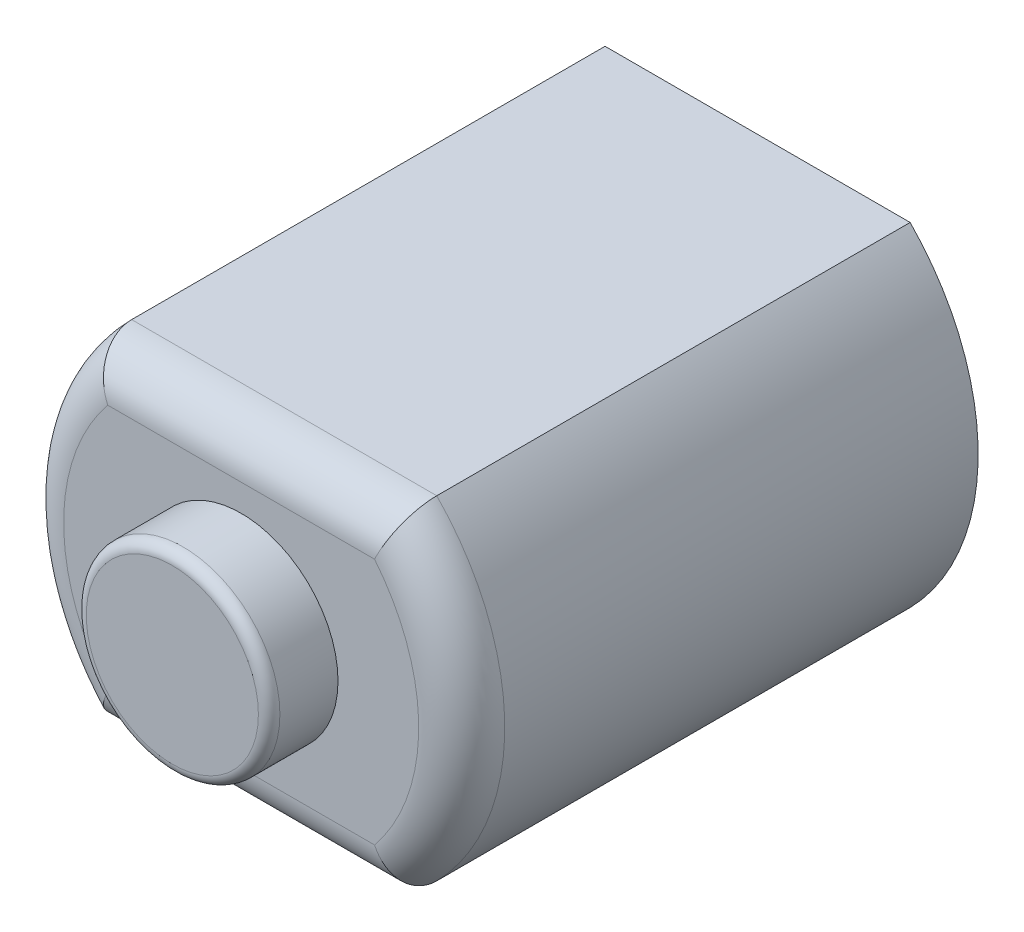
ISO-10303-21;
HEADER;
FILE_DESCRIPTION(('STEP AP214'),'2;1');
FILE_NAME('part.step','',(''),(''),'','','');
FILE_SCHEMA(('AUTOMOTIVE_DESIGN { 1 0 10303 214 1 1 1 1 }'));
ENDSEC;
DATA;
#1=APPLICATION_CONTEXT('core data for automotive mechanical design processes');
#2=APPLICATION_PROTOCOL_DEFINITION('international standard','automotive_design',2000,#1);
#3=PRODUCT_CONTEXT('',#1,'mechanical');
#4=PRODUCT('Part','Part','',(#3));
#5=PRODUCT_RELATED_PRODUCT_CATEGORY('part','',(#4));
#6=PRODUCT_DEFINITION_FORMATION('','',#4);
#7=PRODUCT_DEFINITION_CONTEXT('part definition',#1,'design');
#8=PRODUCT_DEFINITION('design','',#6,#7);
#9=PRODUCT_DEFINITION_SHAPE('','',#8);
#10=(LENGTH_UNIT() NAMED_UNIT(*) SI_UNIT(.MILLI.,.METRE.));
#11=(NAMED_UNIT(*) PLANE_ANGLE_UNIT() SI_UNIT($,.RADIAN.));
#12=(NAMED_UNIT(*) SI_UNIT($,.STERADIAN.) SOLID_ANGLE_UNIT());
#13=UNCERTAINTY_MEASURE_WITH_UNIT(LENGTH_MEASURE(1.E-05),#10,'distance_accuracy_value','');
#14=(GEOMETRIC_REPRESENTATION_CONTEXT(3) GLOBAL_UNCERTAINTY_ASSIGNED_CONTEXT((#13)) GLOBAL_UNIT_ASSIGNED_CONTEXT((#10,
#11,#12)) REPRESENTATION_CONTEXT('',''));
#15=CARTESIAN_POINT('',(0.,0.,0.));
#16=DIRECTION('',(0.,0.,1.));
#17=DIRECTION('',(1.,0.,0.));
#18=AXIS2_PLACEMENT_3D('',#15,#16,#17);
#19=CARTESIAN_POINT('',(0.833560126582283,0.,24.));
#20=DIRECTION('',(0.,0.,-1.));
#21=DIRECTION('',(-1.,0.,0.));
#22=AXIS2_PLACEMENT_3D('',#19,#20,#21);
#23=CYLINDRICAL_SURFACE('',#22,11.0835601265823);
#24=DIRECTION('',(0.,0.,-1.));
#25=VECTOR('',#24,1.);
#26=CARTESIAN_POINT('',(-7.09,-7.75,24.));
#27=LINE('',#26,#25);
#28=CARTESIAN_POINT('',(-7.09,-7.75,22.));
#29=VERTEX_POINT('',#28);
#30=CARTESIAN_POINT('',(-7.09,-7.75,0.));
#31=VERTEX_POINT('',#30);
#32=EDGE_CURVE('E95',#29,#31,#27,.T.);
#33=ORIENTED_EDGE('',*,*,#32,.F.);
#34=CARTESIAN_POINT('',(0.833560126582283,0.,22.));
#35=DIRECTION('',(0.,0.,1.));
#36=DIRECTION('',(1.,0.,0.));
#37=AXIS2_PLACEMENT_3D('',#34,#35,#36);
#38=CIRCLE('',#37,11.0835601265823);
#39=CARTESIAN_POINT('',(-7.09,7.75,22.));
#40=VERTEX_POINT('',#39);
#41=EDGE_CURVE('E145',#29,#40,#38,.F.);
#42=ORIENTED_EDGE('',*,*,#41,.T.);
#43=DIRECTION('',(0.,0.,-1.));
#44=VECTOR('',#43,1.);
#45=CARTESIAN_POINT('',(-7.09,7.75,24.));
#46=LINE('',#45,#44);
#47=CARTESIAN_POINT('',(-7.09,7.75,0.));
#48=VERTEX_POINT('',#47);
#49=EDGE_CURVE('E115',#40,#48,#46,.T.);
#50=ORIENTED_EDGE('',*,*,#49,.T.);
#51=CARTESIAN_POINT('',(0.833560126582283,0.,0.));
#52=DIRECTION('',(0.,0.,1.));
#53=DIRECTION('',(1.,0.,0.));
#54=AXIS2_PLACEMENT_3D('',#51,#52,#53);
#55=CIRCLE('',#54,11.0835601265823);
#56=EDGE_CURVE('E110',#48,#31,#55,.T.);
#57=ORIENTED_EDGE('',*,*,#56,.T.);
#58=EDGE_LOOP('',(#33,#42,#50,#57));
#59=FACE_BOUND('',#58,.T.);
#60=ADVANCED_FACE('F43',(#59),#23,.T.);
#61=CARTESIAN_POINT('',(7.09,-7.75,24.));
#62=DIRECTION('',(0.,1.,0.));
#63=DIRECTION('',(0.,0.,1.));
#64=AXIS2_PLACEMENT_3D('',#61,#62,#63);
#65=PLANE('',#64);
#66=DIRECTION('',(0.,0.,-1.));
#67=VECTOR('',#66,1.);
#68=CARTESIAN_POINT('',(7.09,-7.75,24.));
#69=LINE('',#68,#67);
#70=CARTESIAN_POINT('',(7.09,-7.75,22.));
#71=VERTEX_POINT('',#70);
#72=CARTESIAN_POINT('',(7.09,-7.75,0.));
#73=VERTEX_POINT('',#72);
#74=EDGE_CURVE('E104',#71,#73,#69,.T.);
#75=ORIENTED_EDGE('',*,*,#74,.F.);
#76=DIRECTION('',(1.,0.,0.));
#77=VECTOR('',#76,1.);
#78=CARTESIAN_POINT('',(-7.09,-7.75,22.));
#79=LINE('',#78,#77);
#80=EDGE_CURVE('E58',#71,#29,#79,.F.);
#81=ORIENTED_EDGE('',*,*,#80,.T.);
#82=ORIENTED_EDGE('',*,*,#32,.T.);
#83=DIRECTION('',(1.,0.,0.));
#84=VECTOR('',#83,1.);
#85=CARTESIAN_POINT('',(7.09,-7.75,0.));
#86=LINE('',#85,#84);
#87=EDGE_CURVE('E98',#31,#73,#86,.T.);
#88=ORIENTED_EDGE('',*,*,#87,.T.);
#89=EDGE_LOOP('',(#75,#81,#82,#88));
#90=FACE_BOUND('',#89,.T.);
#91=ADVANCED_FACE('F97',(#90),#65,.F.);
#92=CARTESIAN_POINT('',(-0.833560126582283,0.,24.));
#93=DIRECTION('',(0.,0.,-1.));
#94=DIRECTION('',(-1.,0.,0.));
#95=AXIS2_PLACEMENT_3D('',#92,#93,#94);
#96=CYLINDRICAL_SURFACE('',#95,11.0835601265823);
#97=DIRECTION('',(0.,0.,-1.));
#98=VECTOR('',#97,1.);
#99=CARTESIAN_POINT('',(7.09,7.75,24.));
#100=LINE('',#99,#98);
#101=CARTESIAN_POINT('',(7.09,7.75,22.));
#102=VERTEX_POINT('',#101);
#103=CARTESIAN_POINT('',(7.09,7.75,0.));
#104=VERTEX_POINT('',#103);
#105=EDGE_CURVE('E129',#102,#104,#100,.T.);
#106=ORIENTED_EDGE('',*,*,#105,.F.);
#107=CARTESIAN_POINT('',(-0.833560126582283,0.,22.));
#108=DIRECTION('',(0.,0.,1.));
#109=DIRECTION('',(1.,0.,0.));
#110=AXIS2_PLACEMENT_3D('',#107,#108,#109);
#111=CIRCLE('',#110,11.0835601265823);
#112=EDGE_CURVE('E66',#102,#71,#111,.F.);
#113=ORIENTED_EDGE('',*,*,#112,.T.);
#114=ORIENTED_EDGE('',*,*,#74,.T.);
#115=CARTESIAN_POINT('',(-0.833560126582283,0.,0.));
#116=DIRECTION('',(0.,0.,1.));
#117=DIRECTION('',(-1.,0.,0.));
#118=AXIS2_PLACEMENT_3D('',#115,#116,#117);
#119=CIRCLE('',#118,11.0835601265823);
#120=EDGE_CURVE('E112',#73,#104,#119,.T.);
#121=ORIENTED_EDGE('',*,*,#120,.T.);
#122=EDGE_LOOP('',(#106,#113,#114,#121));
#123=FACE_BOUND('',#122,.T.);
#124=ADVANCED_FACE('F198',(#123),#96,.T.);
#125=CARTESIAN_POINT('',(7.09,7.75,24.));
#126=DIRECTION('',(0.,-1.,0.));
#127=DIRECTION('',(0.,0.,-1.));
#128=AXIS2_PLACEMENT_3D('',#125,#126,#127);
#129=PLANE('',#128);
#130=ORIENTED_EDGE('',*,*,#49,.F.);
#131=DIRECTION('',(-1.,0.,0.));
#132=VECTOR('',#131,1.);
#133=CARTESIAN_POINT('',(7.09,7.75,22.));
#134=LINE('',#133,#132);
#135=EDGE_CURVE('E140',#40,#102,#134,.F.);
#136=ORIENTED_EDGE('',*,*,#135,.T.);
#137=ORIENTED_EDGE('',*,*,#105,.T.);
#138=DIRECTION('',(-1.,0.,0.));
#139=VECTOR('',#138,1.);
#140=CARTESIAN_POINT('',(7.09,7.75,0.));
#141=LINE('',#140,#139);
#142=EDGE_CURVE('E126',#104,#48,#141,.T.);
#143=ORIENTED_EDGE('',*,*,#142,.T.);
#144=EDGE_LOOP('',(#130,#136,#137,#143));
#145=FACE_BOUND('',#144,.T.);
#146=ADVANCED_FACE('F203',(#145),#129,.F.);
#147=CARTESIAN_POINT('',(0.833560126582283,0.,24.));
#148=DIRECTION('',(0.,0.,1.));
#149=DIRECTION('',(1.,0.,0.));
#150=AXIS2_PLACEMENT_3D('',#147,#148,#149);
#151=PLANE('',#150);
#152=CARTESIAN_POINT('',(0.,0.,24.));
#153=DIRECTION('',(0.,0.,1.));
#154=DIRECTION('',(1.,0.,0.));
#155=AXIS2_PLACEMENT_3D('',#152,#153,#154);
#156=CIRCLE('',#155,4.5);
#157=CARTESIAN_POINT('',(4.5,0.,24.));
#158=VERTEX_POINT('',#157);
#159=EDGE_CURVE('E123',#158,#158,#156,.T.);
#160=ORIENTED_EDGE('',*,*,#159,.F.);
#161=EDGE_LOOP('',(#160));
#162=FACE_BOUND('',#161,.T.);
#163=CARTESIAN_POINT('',(-0.833560126582283,0.,24.));
#164=DIRECTION('',(0.,0.,1.));
#165=DIRECTION('',(1.,0.,0.));
#166=AXIS2_PLACEMENT_3D('',#163,#164,#165);
#167=CIRCLE('',#166,9.08356012658228);
#168=CARTESIAN_POINT('',(6.19840720647861,-5.75,24.));
#169=VERTEX_POINT('',#168);
#170=CARTESIAN_POINT('',(6.19840720647861,5.75,24.));
#171=VERTEX_POINT('',#170);
#172=EDGE_CURVE('E135',#169,#171,#167,.T.);
#173=ORIENTED_EDGE('',*,*,#172,.T.);
#174=DIRECTION('',(-1.,0.,0.));
#175=VECTOR('',#174,1.);
#176=CARTESIAN_POINT('',(-7.09,5.75,24.));
#177=LINE('',#176,#175);
#178=CARTESIAN_POINT('',(-6.19840720647861,5.75,24.));
#179=VERTEX_POINT('',#178);
#180=EDGE_CURVE('E137',#171,#179,#177,.T.);
#181=ORIENTED_EDGE('',*,*,#180,.T.);
#182=CARTESIAN_POINT('',(0.833560126582283,0.,24.));
#183=DIRECTION('',(0.,0.,1.));
#184=DIRECTION('',(1.,0.,0.));
#185=AXIS2_PLACEMENT_3D('',#182,#183,#184);
#186=CIRCLE('',#185,9.08356012658228);
#187=CARTESIAN_POINT('',(-6.19840720647861,-5.75,24.));
#188=VERTEX_POINT('',#187);
#189=EDGE_CURVE('E103',#179,#188,#186,.T.);
#190=ORIENTED_EDGE('',*,*,#189,.T.);
#191=DIRECTION('',(1.,0.,0.));
#192=VECTOR('',#191,1.);
#193=CARTESIAN_POINT('',(7.09,-5.75,24.));
#194=LINE('',#193,#192);
#195=EDGE_CURVE('E133',#188,#169,#194,.T.);
#196=ORIENTED_EDGE('',*,*,#195,.T.);
#197=EDGE_LOOP('',(#173,#181,#190,#196));
#198=FACE_BOUND('',#197,.T.);
#199=ADVANCED_FACE('F192',(#162,#198),#151,.T.);
#200=CARTESIAN_POINT('',(0.833560126582283,0.,0.));
#201=DIRECTION('',(0.,0.,1.));
#202=DIRECTION('',(1.,0.,0.));
#203=AXIS2_PLACEMENT_3D('',#200,#201,#202);
#204=PLANE('',#203);
#205=ORIENTED_EDGE('',*,*,#56,.F.);
#206=ORIENTED_EDGE('',*,*,#142,.F.);
#207=ORIENTED_EDGE('',*,*,#120,.F.);
#208=ORIENTED_EDGE('',*,*,#87,.F.);
#209=EDGE_LOOP('',(#205,#206,#207,#208));
#210=FACE_BOUND('',#209,.T.);
#211=ADVANCED_FACE('F108',(#210),#204,.F.);
#212=CARTESIAN_POINT('',(0.833560126582283,-5.75,22.));
#213=DIRECTION('',(-1.,0.,0.));
#214=DIRECTION('',(0.,0.,1.));
#215=AXIS2_PLACEMENT_3D('',#212,#213,#214);
#216=CYLINDRICAL_SURFACE('',#215,2.);
#217=CARTESIAN_POINT('',(-7.09,-7.75,22.));
#218=CARTESIAN_POINT('',(-7.09000251059634,-7.75000744147521,22.0529926489327));
#219=CARTESIAN_POINT('',(-7.08911394930164,-7.74789397815356,22.1059815092053));
#220=CARTESIAN_POINT('',(-7.08557416584439,-7.73948228512946,22.211556737457));
#221=CARTESIAN_POINT('',(-7.0829232863609,-7.73318486898794,22.2641431816747));
#222=CARTESIAN_POINT('',(-7.07588778205616,-7.71648469591555,22.3683995791925));
#223=CARTESIAN_POINT('',(-7.071507825864,-7.70609299399214,22.4200716121355));
#224=CARTESIAN_POINT('',(-7.06105559519545,-7.68132345748143,22.5222623695));
#225=CARTESIAN_POINT('',(-7.05498329405841,-7.6669455600969,22.5727810757388));
#226=CARTESIAN_POINT('',(-7.03429836769747,-7.61803887064901,22.7220551754875));
#227=CARTESIAN_POINT('',(-7.01720956248533,-7.57771760645773,22.8186482446152));
#228=CARTESIAN_POINT('',(-6.97698013341922,-7.48321793665207,23.0033665951101));
#229=CARTESIAN_POINT('',(-6.95383739606473,-7.42903469179918,23.0914889045122));
#230=CARTESIAN_POINT('',(-6.90137934603258,-7.30689666682277,23.2598420439186));
#231=CARTESIAN_POINT('',(-6.87189996524071,-7.23857812282158,23.3397575921521));
#232=CARTESIAN_POINT('',(-6.80801045594482,-7.09151124061425,23.4870063175584));
#233=CARTESIAN_POINT('',(-6.77359891436954,-7.01275991389181,23.5543358760448));
#234=CARTESIAN_POINT('',(-6.69796902293111,-6.84100105638926,23.6798358121778));
#235=CARTESIAN_POINT('',(-6.65643558571622,-6.74737008049875,23.7369617046311));
#236=CARTESIAN_POINT('',(-6.56962348946352,-6.55344731168661,23.8347405122226));
#237=CARTESIAN_POINT('',(-6.52434288879081,-6.45315207097246,23.8753848220727));
#238=CARTESIAN_POINT('',(-6.43372165266033,-6.25439815965746,23.9379940682496));
#239=CARTESIAN_POINT('',(-6.38853138569523,-6.15616035109053,23.9608912176401));
#240=CARTESIAN_POINT('',(-6.29659240195031,-5.95824664778769,23.9916401391918));
#241=CARTESIAN_POINT('',(-6.2498469832177,-5.85857402258226,23.999521913842));
#242=CARTESIAN_POINT('',(-6.20130984149857,-5.75612389497142,23.9999929839316));
#243=CARTESIAN_POINT('',(-6.19985867876987,-5.75306179617439,24.0000000157442));
#244=CARTESIAN_POINT('',(-6.19840720647861,-5.75,24.));
#245=B_SPLINE_CURVE_WITH_KNOTS('',3,(#217,#218,#219,#220,#221,#222,#223,#224,#225,#226,#227,
#228,#229,#230,#231,#232,#233,#234,#235,#236,#237,#238,#239,#240,#241,#242,#243,#244),
.UNSPECIFIED.,.F.,.F.,(4,2,2,2,2,2,2,2,2,2,2,2,2,4),(0.,0.158921879220741,0.317812865453171,
0.476277737332346,0.634745105757474,0.951319828516782,1.26800521915922,1.59417259659958,
1.92043360896063,2.27080395920088,2.62135700838885,2.95193995991055,3.28186167206402,
3.29202733152508),.UNSPECIFIED.);
#246=EDGE_CURVE('E120',#29,#188,#245,.T.);
#247=ORIENTED_EDGE('',*,*,#246,.F.);
#248=ORIENTED_EDGE('',*,*,#80,.F.);
#249=CARTESIAN_POINT('',(7.09,-7.75,22.));
#250=CARTESIAN_POINT('',(7.09000251059634,-7.75000744147521,22.0529926489327));
#251=CARTESIAN_POINT('',(7.08911394930164,-7.74789397815356,22.1059815092053));
#252=CARTESIAN_POINT('',(7.08557416584439,-7.73948228512946,22.211556737457));
#253=CARTESIAN_POINT('',(7.0829232863609,-7.73318486898794,22.2641431816747));
#254=CARTESIAN_POINT('',(7.07588778205616,-7.71648469591555,22.3683995791925));
#255=CARTESIAN_POINT('',(7.07150782586399,-7.70609299399214,22.4200716121355));
#256=CARTESIAN_POINT('',(7.06105559519545,-7.68132345748143,22.5222623695));
#257=CARTESIAN_POINT('',(7.05498329405841,-7.6669455600969,22.5727810757388));
#258=CARTESIAN_POINT('',(7.03429836769747,-7.61803887064901,22.7220551754875));
#259=CARTESIAN_POINT('',(7.01720956248533,-7.57771760645773,22.8186482446152));
#260=CARTESIAN_POINT('',(6.97698013341922,-7.48321793665207,23.0033665951101));
#261=CARTESIAN_POINT('',(6.95383739606473,-7.42903469179918,23.0914889045122));
#262=CARTESIAN_POINT('',(6.90137934603258,-7.30689666682277,23.2598420439186));
#263=CARTESIAN_POINT('',(6.8718999652407,-7.23857812282158,23.3397575921521));
#264=CARTESIAN_POINT('',(6.80801045594482,-7.09151124061425,23.4870063175584));
#265=CARTESIAN_POINT('',(6.77359891436954,-7.0127599138918,23.5543358760448));
#266=CARTESIAN_POINT('',(6.69796902293111,-6.84100105638927,23.6798358121778));
#267=CARTESIAN_POINT('',(6.6564355857162,-6.74737008049877,23.7369617046311));
#268=CARTESIAN_POINT('',(6.56962348946355,-6.5534473116866,23.8347405122226));
#269=CARTESIAN_POINT('',(6.52434288879091,-6.45315207097241,23.8753848220727));
#270=CARTESIAN_POINT('',(6.43372165266024,-6.2543981596575,23.9379940682496));
#271=CARTESIAN_POINT('',(6.3885313856949,-6.15616035109068,23.9608912176401));
#272=CARTESIAN_POINT('',(6.29659240195063,-5.95824664778753,23.9916401391919));
#273=CARTESIAN_POINT('',(6.24984698321891,-5.85857402258168,23.999521913842));
#274=CARTESIAN_POINT('',(6.20130984149864,-5.75612389497139,23.9999929839316));
#275=CARTESIAN_POINT('',(6.19985867876991,-5.75306179617437,24.0000000157442));
#276=CARTESIAN_POINT('',(6.19840720647861,-5.75,24.));
#277=B_SPLINE_CURVE_WITH_KNOTS('',3,(#249,#250,#251,#252,#253,#254,#255,#256,#257,#258,#259,
#260,#261,#262,#263,#264,#265,#266,#267,#268,#269,#270,#271,#272,#273,#274,#275,#276),
.UNSPECIFIED.,.F.,.F.,(4,2,2,2,2,2,2,2,2,2,2,2,2,4),(0.,0.158921879220741,0.317812865453171,
0.476277737332346,0.634745105757474,0.951319828516782,1.26800521915922,1.59417259659959,
1.92043360896063,2.27080395920088,2.62135700838885,2.95193995991056,3.28186167206402,
3.29202733152508),.UNSPECIFIED.);
#278=EDGE_CURVE('E117',#169,#71,#277,.F.);
#279=ORIENTED_EDGE('',*,*,#278,.F.);
#280=ORIENTED_EDGE('',*,*,#195,.F.);
#281=EDGE_LOOP('',(#247,#248,#279,#280));
#282=FACE_BOUND('',#281,.T.);
#283=ADVANCED_FACE('F181',(#282),#216,.T.);
#284=CARTESIAN_POINT('',(-0.833560126582283,0.,22.));
#285=DIRECTION('',(0.,0.,1.));
#286=DIRECTION('',(1.,0.,0.));
#287=AXIS2_PLACEMENT_3D('',#284,#285,#286);
#288=TOROIDAL_SURFACE('',#287,9.08356012658228,2.);
#289=ORIENTED_EDGE('',*,*,#278,.T.);
#290=ORIENTED_EDGE('',*,*,#112,.F.);
#291=CARTESIAN_POINT('',(7.09,7.75,22.));
#292=CARTESIAN_POINT('',(7.09000251059635,7.7500074414752,22.0529926489327));
#293=CARTESIAN_POINT('',(7.08911394930164,7.74789397815355,22.1059815092053));
#294=CARTESIAN_POINT('',(7.0855741658444,7.73948228512946,22.211556737457));
#295=CARTESIAN_POINT('',(7.0829232863609,7.73318486898793,22.2641431816747));
#296=CARTESIAN_POINT('',(7.07588778205616,7.71648469591554,22.3683995791925));
#297=CARTESIAN_POINT('',(7.071507825864,7.70609299399213,22.4200716121355));
#298=CARTESIAN_POINT('',(7.06105559519546,7.68132345748143,22.5222623695));
#299=CARTESIAN_POINT('',(7.05498329405842,7.6669455600969,22.5727810757388));
#300=CARTESIAN_POINT('',(7.03429836769748,7.61803887064901,22.7220551754875));
#301=CARTESIAN_POINT('',(7.01720956248533,7.57771760645773,22.8186482446152));
#302=CARTESIAN_POINT('',(6.97698013341922,7.48321793665207,23.0033665951101));
#303=CARTESIAN_POINT('',(6.95383739606474,7.42903469179917,23.0914889045122));
#304=CARTESIAN_POINT('',(6.90137934603259,7.30689666682277,23.2598420439186));
#305=CARTESIAN_POINT('',(6.87189996524071,7.23857812282158,23.3397575921521));
#306=CARTESIAN_POINT('',(6.80801045594483,7.09151124061425,23.4870063175584));
#307=CARTESIAN_POINT('',(6.77359891436955,7.0127599138918,23.5543358760448));
#308=CARTESIAN_POINT('',(6.69796902293111,6.84100105638926,23.6798358121778));
#309=CARTESIAN_POINT('',(6.6564355857162,6.74737008049877,23.7369617046311));
#310=CARTESIAN_POINT('',(6.56962348946355,6.5534473116866,23.8347405122226));
#311=CARTESIAN_POINT('',(6.52434288879091,6.45315207097241,23.8753848220727));
#312=CARTESIAN_POINT('',(6.43372165266025,6.25439815965749,23.9379940682496));
#313=CARTESIAN_POINT('',(6.3885313856949,6.15616035109068,23.9608912176401));
#314=CARTESIAN_POINT('',(6.29659240195064,5.95824664778752,23.9916401391919));
#315=CARTESIAN_POINT('',(6.24984698321893,5.85857402258167,23.999521913842));
#316=CARTESIAN_POINT('',(6.20130984149864,5.75612389497138,23.9999929839316));
#317=CARTESIAN_POINT('',(6.19985867876991,5.75306179617437,24.0000000157442));
#318=CARTESIAN_POINT('',(6.19840720647861,5.75,24.));
#319=B_SPLINE_CURVE_WITH_KNOTS('',3,(#291,#292,#293,#294,#295,#296,#297,#298,#299,#300,#301,
#302,#303,#304,#305,#306,#307,#308,#309,#310,#311,#312,#313,#314,#315,#316,#317,#318),
.UNSPECIFIED.,.F.,.F.,(4,2,2,2,2,2,2,2,2,2,2,2,2,4),(0.,0.158921879220741,0.317812865453171,
0.476277737332346,0.634745105757475,0.951319828516782,1.26800521915922,1.59417259659958,
1.92043360896063,2.27080395920087,2.62135700838885,2.95193995991056,3.28186167206402,
3.29202733152508),.UNSPECIFIED.);
#320=EDGE_CURVE('E155',#171,#102,#319,.F.);
#321=ORIENTED_EDGE('',*,*,#320,.F.);
#322=ORIENTED_EDGE('',*,*,#172,.F.);
#323=EDGE_LOOP('',(#289,#290,#321,#322));
#324=FACE_BOUND('',#323,.T.);
#325=ADVANCED_FACE('F168',(#324),#288,.T.);
#326=CARTESIAN_POINT('',(0.833560126582283,0.,22.));
#327=DIRECTION('',(0.,0.,1.));
#328=DIRECTION('',(1.,0.,0.));
#329=AXIS2_PLACEMENT_3D('',#326,#327,#328);
#330=TOROIDAL_SURFACE('',#329,9.08356012658228,2.);
#331=ORIENTED_EDGE('',*,*,#246,.T.);
#332=ORIENTED_EDGE('',*,*,#189,.F.);
#333=CARTESIAN_POINT('',(-7.09,7.75,22.));
#334=CARTESIAN_POINT('',(-7.09000251059635,7.7500074414752,22.0529926489327));
#335=CARTESIAN_POINT('',(-7.08911394930164,7.74789397815355,22.1059815092053));
#336=CARTESIAN_POINT('',(-7.0855741658444,7.73948228512946,22.211556737457));
#337=CARTESIAN_POINT('',(-7.0829232863609,7.73318486898793,22.2641431816747));
#338=CARTESIAN_POINT('',(-7.07588778205616,7.71648469591554,22.3683995791925));
#339=CARTESIAN_POINT('',(-7.071507825864,7.70609299399213,22.4200716121355));
#340=CARTESIAN_POINT('',(-7.06105559519546,7.68132345748143,22.5222623695));
#341=CARTESIAN_POINT('',(-7.05498329405842,7.6669455600969,22.5727810757388));
#342=CARTESIAN_POINT('',(-7.03429836769748,7.61803887064901,22.7220551754875));
#343=CARTESIAN_POINT('',(-7.01720956248533,7.57771760645773,22.8186482446152));
#344=CARTESIAN_POINT('',(-6.97698013341922,7.48321793665207,23.0033665951101));
#345=CARTESIAN_POINT('',(-6.95383739606474,7.42903469179917,23.0914889045122));
#346=CARTESIAN_POINT('',(-6.90137934603259,7.30689666682277,23.2598420439186));
#347=CARTESIAN_POINT('',(-6.87189996524071,7.23857812282158,23.3397575921521));
#348=CARTESIAN_POINT('',(-6.80801045594483,7.09151124061425,23.4870063175584));
#349=CARTESIAN_POINT('',(-6.77359891436955,7.0127599138918,23.5543358760448));
#350=CARTESIAN_POINT('',(-6.69796902293111,6.84100105638926,23.6798358121778));
#351=CARTESIAN_POINT('',(-6.6564355857162,6.74737008049877,23.7369617046311));
#352=CARTESIAN_POINT('',(-6.56962348946355,6.5534473116866,23.8347405122226));
#353=CARTESIAN_POINT('',(-6.52434288879091,6.45315207097241,23.8753848220727));
#354=CARTESIAN_POINT('',(-6.43372165266025,6.25439815965749,23.9379940682496));
#355=CARTESIAN_POINT('',(-6.3885313856949,6.15616035109068,23.9608912176401));
#356=CARTESIAN_POINT('',(-6.29659240195064,5.95824664778752,23.9916401391919));
#357=CARTESIAN_POINT('',(-6.24984698321893,5.85857402258167,23.999521913842));
#358=CARTESIAN_POINT('',(-6.20130984149864,5.75612389497138,23.9999929839316));
#359=CARTESIAN_POINT('',(-6.19985867876991,5.75306179617437,24.0000000157442));
#360=CARTESIAN_POINT('',(-6.19840720647861,5.75,24.));
#361=B_SPLINE_CURVE_WITH_KNOTS('',3,(#333,#334,#335,#336,#337,#338,#339,#340,#341,#342,#343,
#344,#345,#346,#347,#348,#349,#350,#351,#352,#353,#354,#355,#356,#357,#358,#359,#360),
.UNSPECIFIED.,.F.,.F.,(4,2,2,2,2,2,2,2,2,2,2,2,2,4),(0.,0.158921879220741,0.317812865453171,
0.476277737332346,0.634745105757475,0.951319828516782,1.26800521915922,1.59417259659958,
1.92043360896063,2.27080395920087,2.62135700838885,2.95193995991056,3.28186167206402,
3.29202733152508),.UNSPECIFIED.);
#362=EDGE_CURVE('E147',#40,#179,#361,.T.);
#363=ORIENTED_EDGE('',*,*,#362,.F.);
#364=ORIENTED_EDGE('',*,*,#41,.F.);
#365=EDGE_LOOP('',(#331,#332,#363,#364));
#366=FACE_BOUND('',#365,.T.);
#367=ADVANCED_FACE('F165',(#366),#330,.T.);
#368=CARTESIAN_POINT('',(0.833560126582283,5.75,22.));
#369=DIRECTION('',(1.,0.,0.));
#370=DIRECTION('',(0.,0.,-1.));
#371=AXIS2_PLACEMENT_3D('',#368,#369,#370);
#372=CYLINDRICAL_SURFACE('',#371,2.);
#373=ORIENTED_EDGE('',*,*,#320,.T.);
#374=ORIENTED_EDGE('',*,*,#135,.F.);
#375=ORIENTED_EDGE('',*,*,#362,.T.);
#376=ORIENTED_EDGE('',*,*,#180,.F.);
#377=EDGE_LOOP('',(#373,#374,#375,#376));
#378=FACE_BOUND('',#377,.T.);
#379=ADVANCED_FACE('F162',(#378),#372,.T.);
#380=CARTESIAN_POINT('',(0.,0.,27.2));
#381=DIRECTION('',(0.,0.,-1.));
#382=DIRECTION('',(-1.,0.,0.));
#383=AXIS2_PLACEMENT_3D('',#380,#381,#382);
#384=CYLINDRICAL_SURFACE('',#383,4.5);
#385=CARTESIAN_POINT('',(0.,0.,26.7));
#386=DIRECTION('',(0.,0.,1.));
#387=DIRECTION('',(1.,0.,0.));
#388=AXIS2_PLACEMENT_3D('',#385,#386,#387);
#389=CIRCLE('',#388,4.5);
#390=CARTESIAN_POINT('',(4.5,0.,26.7));
#391=VERTEX_POINT('',#390);
#392=EDGE_CURVE('E11',#391,#391,#389,.F.);
#393=ORIENTED_EDGE('',*,*,#392,.T.);
#394=EDGE_LOOP('',(#393));
#395=FACE_BOUND('',#394,.T.);
#396=ORIENTED_EDGE('',*,*,#159,.T.);
#397=EDGE_LOOP('',(#396));
#398=FACE_BOUND('',#397,.T.);
#399=ADVANCED_FACE('F209',(#395,#398),#384,.T.);
#400=CARTESIAN_POINT('',(0.,0.,27.2));
#401=DIRECTION('',(0.,0.,1.));
#402=DIRECTION('',(1.,0.,0.));
#403=AXIS2_PLACEMENT_3D('',#400,#401,#402);
#404=PLANE('',#403);
#405=CARTESIAN_POINT('',(0.,0.,27.2));
#406=DIRECTION('',(0.,0.,1.));
#407=DIRECTION('',(1.,0.,0.));
#408=AXIS2_PLACEMENT_3D('',#405,#406,#407);
#409=CIRCLE('',#408,4.);
#410=CARTESIAN_POINT('',(4.,0.,27.2));
#411=VERTEX_POINT('',#410);
#412=EDGE_CURVE('E51',#411,#411,#409,.T.);
#413=ORIENTED_EDGE('',*,*,#412,.T.);
#414=EDGE_LOOP('',(#413));
#415=FACE_BOUND('',#414,.T.);
#416=ADVANCED_FACE('F212',(#415),#404,.T.);
#417=CARTESIAN_POINT('',(0.,0.,26.7));
#418=DIRECTION('',(0.,0.,1.));
#419=DIRECTION('',(1.,0.,0.));
#420=AXIS2_PLACEMENT_3D('',#417,#418,#419);
#421=TOROIDAL_SURFACE('',#420,4.,0.5);
#422=ORIENTED_EDGE('',*,*,#392,.F.);
#423=EDGE_LOOP('',(#422));
#424=FACE_BOUND('',#423,.T.);
#425=ORIENTED_EDGE('',*,*,#412,.F.);
#426=EDGE_LOOP('',(#425));
#427=FACE_BOUND('',#426,.T.);
#428=ADVANCED_FACE('F45',(#424,#427),#421,.T.);
#429=CLOSED_SHELL('',(#60,#91,#124,#146,#199,#211,#283,#325,#367,#379,#399,#416,#428));
#430=MANIFOLD_SOLID_BREP('B2',#429);
#431=ADVANCED_BREP_SHAPE_REPRESENTATION('',(#18,#430),#14);
#432=SHAPE_DEFINITION_REPRESENTATION(#9,#431);
ENDSEC;
END-ISO-10303-21;
